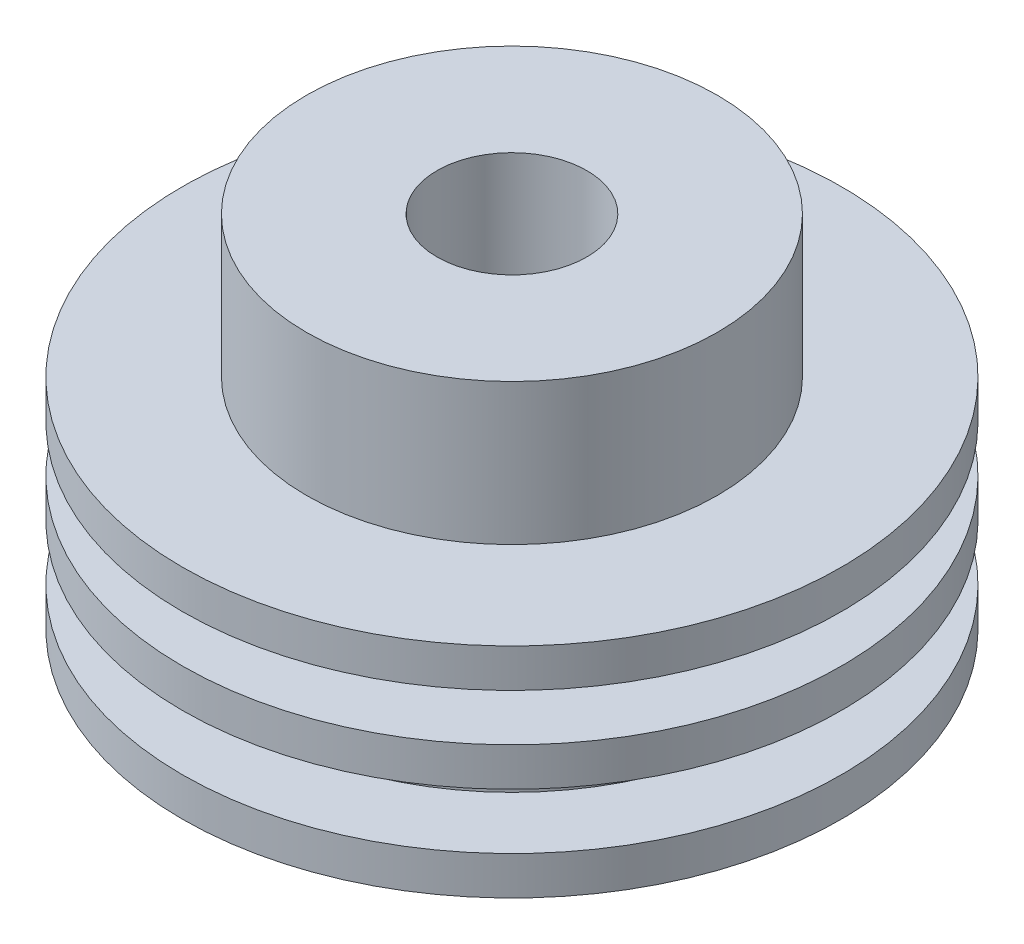
ISO-10303-21;
HEADER;
FILE_DESCRIPTION(('STEP AP214'),'2;1');
FILE_NAME('part.step','',(''),(''),'','','');
FILE_SCHEMA(('AUTOMOTIVE_DESIGN { 1 0 10303 214 1 1 1 1 }'));
ENDSEC;
DATA;
#1=APPLICATION_CONTEXT('core data for automotive mechanical design processes');
#2=APPLICATION_PROTOCOL_DEFINITION('international standard','automotive_design',2000,#1);
#3=PRODUCT_CONTEXT('',#1,'mechanical');
#4=PRODUCT('Part','Part','',(#3));
#5=PRODUCT_RELATED_PRODUCT_CATEGORY('part','',(#4));
#6=PRODUCT_DEFINITION_FORMATION('','',#4);
#7=PRODUCT_DEFINITION_CONTEXT('part definition',#1,'design');
#8=PRODUCT_DEFINITION('design','',#6,#7);
#9=PRODUCT_DEFINITION_SHAPE('','',#8);
#10=(LENGTH_UNIT() NAMED_UNIT(*) SI_UNIT(.MILLI.,.METRE.));
#11=(NAMED_UNIT(*) PLANE_ANGLE_UNIT() SI_UNIT($,.RADIAN.));
#12=(NAMED_UNIT(*) SI_UNIT($,.STERADIAN.) SOLID_ANGLE_UNIT());
#13=UNCERTAINTY_MEASURE_WITH_UNIT(LENGTH_MEASURE(1.E-05),#10,'distance_accuracy_value','');
#14=(GEOMETRIC_REPRESENTATION_CONTEXT(3) GLOBAL_UNCERTAINTY_ASSIGNED_CONTEXT((#13)) GLOBAL_UNIT_ASSIGNED_CONTEXT((#10,
#11,#12)) REPRESENTATION_CONTEXT('',''));
#15=CARTESIAN_POINT('',(0.,0.,0.));
#16=DIRECTION('',(0.,0.,1.));
#17=DIRECTION('',(1.,0.,0.));
#18=AXIS2_PLACEMENT_3D('',#15,#16,#17);
#19=CARTESIAN_POINT('',(0.,82.9719775820657,0.));
#20=DIRECTION('',(0.,1.,0.));
#21=DIRECTION('',(0.,0.,1.));
#22=AXIS2_PLACEMENT_3D('',#19,#20,#21);
#23=CYLINDRICAL_SURFACE('',#22,17.4105133286958);
#24=CARTESIAN_POINT('',(0.,61.7529144627177,0.));
#25=DIRECTION('',(0.,1.,0.));
#26=DIRECTION('',(0.,0.,1.));
#27=AXIS2_PLACEMENT_3D('',#24,#25,#26);
#28=CIRCLE('',#27,17.4105133286958);
#29=CARTESIAN_POINT('',(0.,61.7529144627177,17.4105133286958));
#30=VERTEX_POINT('',#29);
#31=EDGE_CURVE('E10',#30,#30,#28,.T.);
#32=ORIENTED_EDGE('',*,*,#31,.F.);
#33=EDGE_LOOP('',(#32));
#34=FACE_BOUND('',#33,.T.);
#35=CARTESIAN_POINT('',(0.,49.7831865492394,0.));
#36=DIRECTION('',(0.,1.,0.));
#37=DIRECTION('',(0.,0.,1.));
#38=AXIS2_PLACEMENT_3D('',#35,#36,#37);
#39=CIRCLE('',#38,17.4105133286958);
#40=CARTESIAN_POINT('',(0.,49.7831865492394,17.4105133286958));
#41=VERTEX_POINT('',#40);
#42=EDGE_CURVE('E96',#41,#41,#39,.T.);
#43=ORIENTED_EDGE('',*,*,#42,.T.);
#44=EDGE_LOOP('',(#43));
#45=FACE_BOUND('',#44,.T.);
#46=ADVANCED_FACE('F37',(#34,#45),#23,.T.);
#47=CARTESIAN_POINT('',(6.34758298442034,61.7529144627177,0.));
#48=DIRECTION('',(0.,-1.,0.));
#49=DIRECTION('',(0.,0.,-1.));
#50=AXIS2_PLACEMENT_3D('',#47,#48,#49);
#51=PLANE('',#50);
#52=CARTESIAN_POINT('',(0.,61.7529144627177,0.));
#53=DIRECTION('',(0.,1.,0.));
#54=DIRECTION('',(0.,0.,1.));
#55=AXIS2_PLACEMENT_3D('',#52,#53,#54);
#56=CIRCLE('',#55,6.34758298442034);
#57=CARTESIAN_POINT('',(0.,61.7529144627177,6.34758298442034));
#58=VERTEX_POINT('',#57);
#59=EDGE_CURVE('E44',#58,#58,#56,.T.);
#60=ORIENTED_EDGE('',*,*,#59,.F.);
#61=EDGE_LOOP('',(#60));
#62=FACE_BOUND('',#61,.T.);
#63=ORIENTED_EDGE('',*,*,#31,.T.);
#64=EDGE_LOOP('',(#63));
#65=FACE_BOUND('',#64,.T.);
#66=ADVANCED_FACE('F170',(#62,#65),#51,.F.);
#67=CARTESIAN_POINT('',(0.,82.9719775820657,0.));
#68=DIRECTION('',(0.,1.,0.));
#69=DIRECTION('',(0.,0.,1.));
#70=AXIS2_PLACEMENT_3D('',#67,#68,#69);
#71=CYLINDRICAL_SURFACE('',#70,6.34758298442034);
#72=CARTESIAN_POINT('',(0.,31.2845161375002,0.));
#73=DIRECTION('',(0.,1.,0.));
#74=DIRECTION('',(0.,0.,1.));
#75=AXIS2_PLACEMENT_3D('',#72,#73,#74);
#76=CIRCLE('',#75,6.34758298442034);
#77=CARTESIAN_POINT('',(0.,31.2845161375002,6.34758298442034));
#78=VERTEX_POINT('',#77);
#79=EDGE_CURVE('E49',#78,#78,#76,.T.);
#80=ORIENTED_EDGE('',*,*,#79,.F.);
#81=EDGE_LOOP('',(#80));
#82=FACE_BOUND('',#81,.T.);
#83=ORIENTED_EDGE('',*,*,#59,.T.);
#84=EDGE_LOOP('',(#83));
#85=FACE_BOUND('',#84,.T.);
#86=ADVANCED_FACE('F165',(#82,#85),#71,.F.);
#87=CARTESIAN_POINT('',(27.9293651314494,31.2845161375002,0.));
#88=DIRECTION('',(0.,1.,0.));
#89=DIRECTION('',(0.,0.,1.));
#90=AXIS2_PLACEMENT_3D('',#87,#88,#89);
#91=PLANE('',#90);
#92=CARTESIAN_POINT('',(0.,31.2845161375002,0.));
#93=DIRECTION('',(0.,1.,0.));
#94=DIRECTION('',(0.,0.,1.));
#95=AXIS2_PLACEMENT_3D('',#92,#93,#94);
#96=CIRCLE('',#95,27.9293651314494);
#97=CARTESIAN_POINT('',(0.,31.2845161375002,27.9293651314494));
#98=VERTEX_POINT('',#97);
#99=EDGE_CURVE('E54',#98,#98,#96,.T.);
#100=ORIENTED_EDGE('',*,*,#99,.F.);
#101=EDGE_LOOP('',(#100));
#102=FACE_BOUND('',#101,.T.);
#103=ORIENTED_EDGE('',*,*,#79,.T.);
#104=EDGE_LOOP('',(#103));
#105=FACE_BOUND('',#104,.T.);
#106=ADVANCED_FACE('F159',(#102,#105),#91,.F.);
#107=CARTESIAN_POINT('',(0.,82.9719775820657,0.));
#108=DIRECTION('',(0.,1.,0.));
#109=DIRECTION('',(0.,0.,1.));
#110=AXIS2_PLACEMENT_3D('',#107,#108,#109);
#111=CYLINDRICAL_SURFACE('',#110,27.9293651314494);
#112=CARTESIAN_POINT('',(0.,34.5489873866306,0.));
#113=DIRECTION('',(0.,1.,0.));
#114=DIRECTION('',(0.,0.,1.));
#115=AXIS2_PLACEMENT_3D('',#112,#113,#114);
#116=CIRCLE('',#115,27.9293651314494);
#117=CARTESIAN_POINT('',(0.,34.5489873866306,27.9293651314494));
#118=VERTEX_POINT('',#117);
#119=EDGE_CURVE('E60',#118,#118,#116,.T.);
#120=ORIENTED_EDGE('',*,*,#119,.F.);
#121=EDGE_LOOP('',(#120));
#122=FACE_BOUND('',#121,.T.);
#123=ORIENTED_EDGE('',*,*,#99,.T.);
#124=EDGE_LOOP('',(#123));
#125=FACE_BOUND('',#124,.T.);
#126=ADVANCED_FACE('F153',(#122,#125),#111,.T.);
#127=CARTESIAN_POINT('',(21.5817821470291,34.5489873866306,0.));
#128=DIRECTION('',(0.,-1.,0.));
#129=DIRECTION('',(0.,0.,-1.));
#130=AXIS2_PLACEMENT_3D('',#127,#128,#129);
#131=PLANE('',#130);
#132=CARTESIAN_POINT('',(0.,34.5489873866306,0.));
#133=DIRECTION('',(0.,1.,0.));
#134=DIRECTION('',(0.,0.,1.));
#135=AXIS2_PLACEMENT_3D('',#132,#133,#134);
#136=CIRCLE('',#135,21.5817821470291);
#137=CARTESIAN_POINT('',(0.,34.5489873866306,21.5817821470291));
#138=VERTEX_POINT('',#137);
#139=EDGE_CURVE('E64',#138,#138,#136,.T.);
#140=ORIENTED_EDGE('',*,*,#139,.F.);
#141=EDGE_LOOP('',(#140));
#142=FACE_BOUND('',#141,.T.);
#143=ORIENTED_EDGE('',*,*,#119,.T.);
#144=EDGE_LOOP('',(#143));
#145=FACE_BOUND('',#144,.T.);
#146=ADVANCED_FACE('F147',(#142,#145),#131,.F.);
#147=CARTESIAN_POINT('',(0.,82.9719775820657,0.));
#148=DIRECTION('',(0.,1.,0.));
#149=DIRECTION('',(0.,0.,1.));
#150=AXIS2_PLACEMENT_3D('',#147,#148,#149);
#151=CYLINDRICAL_SURFACE('',#150,21.5817821470291);
#152=CARTESIAN_POINT('',(0.,39.2643347464857,0.));
#153=DIRECTION('',(0.,1.,0.));
#154=DIRECTION('',(0.,0.,1.));
#155=AXIS2_PLACEMENT_3D('',#152,#153,#154);
#156=CIRCLE('',#155,21.5817821470291);
#157=CARTESIAN_POINT('',(0.,39.2643347464857,21.5817821470291));
#158=VERTEX_POINT('',#157);
#159=EDGE_CURVE('E68',#158,#158,#156,.T.);
#160=ORIENTED_EDGE('',*,*,#159,.F.);
#161=EDGE_LOOP('',(#160));
#162=FACE_BOUND('',#161,.T.);
#163=ORIENTED_EDGE('',*,*,#139,.T.);
#164=EDGE_LOOP('',(#163));
#165=FACE_BOUND('',#164,.T.);
#166=ADVANCED_FACE('F141',(#162,#165),#151,.T.);
#167=CARTESIAN_POINT('',(27.9293651314494,39.2643347464857,0.));
#168=DIRECTION('',(0.,1.,0.));
#169=DIRECTION('',(0.,0.,1.));
#170=AXIS2_PLACEMENT_3D('',#167,#168,#169);
#171=PLANE('',#170);
#172=CARTESIAN_POINT('',(0.,39.2643347464857,0.));
#173=DIRECTION('',(0.,1.,0.));
#174=DIRECTION('',(0.,0.,1.));
#175=AXIS2_PLACEMENT_3D('',#172,#173,#174);
#176=CIRCLE('',#175,27.9293651314494);
#177=CARTESIAN_POINT('',(0.,39.2643347464857,27.9293651314494));
#178=VERTEX_POINT('',#177);
#179=EDGE_CURVE('E72',#178,#178,#176,.T.);
#180=ORIENTED_EDGE('',*,*,#179,.F.);
#181=EDGE_LOOP('',(#180));
#182=FACE_BOUND('',#181,.T.);
#183=ORIENTED_EDGE('',*,*,#159,.T.);
#184=EDGE_LOOP('',(#183));
#185=FACE_BOUND('',#184,.T.);
#186=ADVANCED_FACE('F135',(#182,#185),#171,.F.);
#187=CARTESIAN_POINT('',(0.,82.9719775820657,0.));
#188=DIRECTION('',(0.,1.,0.));
#189=DIRECTION('',(0.,0.,1.));
#190=AXIS2_PLACEMENT_3D('',#187,#188,#189);
#191=CYLINDRICAL_SURFACE('',#190,27.9293651314494);
#192=CARTESIAN_POINT('',(0.,42.5288059956162,0.));
#193=DIRECTION('',(0.,1.,0.));
#194=DIRECTION('',(0.,0.,1.));
#195=AXIS2_PLACEMENT_3D('',#192,#193,#194);
#196=CIRCLE('',#195,27.9293651314494);
#197=CARTESIAN_POINT('',(0.,42.5288059956162,27.9293651314494));
#198=VERTEX_POINT('',#197);
#199=EDGE_CURVE('E76',#198,#198,#196,.T.);
#200=ORIENTED_EDGE('',*,*,#199,.F.);
#201=EDGE_LOOP('',(#200));
#202=FACE_BOUND('',#201,.T.);
#203=ORIENTED_EDGE('',*,*,#179,.T.);
#204=EDGE_LOOP('',(#203));
#205=FACE_BOUND('',#204,.T.);
#206=ADVANCED_FACE('F129',(#202,#205),#191,.T.);
#207=CARTESIAN_POINT('',(21.5817821470291,42.5288059956162,0.));
#208=DIRECTION('',(0.,-1.,0.));
#209=DIRECTION('',(0.,0.,-1.));
#210=AXIS2_PLACEMENT_3D('',#207,#208,#209);
#211=PLANE('',#210);
#212=CARTESIAN_POINT('',(0.,42.5288059956162,0.));
#213=DIRECTION('',(0.,1.,0.));
#214=DIRECTION('',(0.,0.,1.));
#215=AXIS2_PLACEMENT_3D('',#212,#213,#214);
#216=CIRCLE('',#215,21.5817821470291);
#217=CARTESIAN_POINT('',(0.,42.5288059956162,21.5817821470291));
#218=VERTEX_POINT('',#217);
#219=EDGE_CURVE('E80',#218,#218,#216,.T.);
#220=ORIENTED_EDGE('',*,*,#219,.F.);
#221=EDGE_LOOP('',(#220));
#222=FACE_BOUND('',#221,.T.);
#223=ORIENTED_EDGE('',*,*,#199,.T.);
#224=EDGE_LOOP('',(#223));
#225=FACE_BOUND('',#224,.T.);
#226=ADVANCED_FACE('F123',(#222,#225),#211,.F.);
#227=CARTESIAN_POINT('',(0.,82.9719775820657,0.));
#228=DIRECTION('',(0.,1.,0.));
#229=DIRECTION('',(0.,0.,1.));
#230=AXIS2_PLACEMENT_3D('',#227,#228,#229);
#231=CYLINDRICAL_SURFACE('',#230,21.5817821470291);
#232=CARTESIAN_POINT('',(0.,46.5187153001089,0.));
#233=DIRECTION('',(0.,1.,0.));
#234=DIRECTION('',(0.,0.,1.));
#235=AXIS2_PLACEMENT_3D('',#232,#233,#234);
#236=CIRCLE('',#235,21.5817821470291);
#237=CARTESIAN_POINT('',(0.,46.5187153001089,21.5817821470291));
#238=VERTEX_POINT('',#237);
#239=EDGE_CURVE('E84',#238,#238,#236,.T.);
#240=ORIENTED_EDGE('',*,*,#239,.F.);
#241=EDGE_LOOP('',(#240));
#242=FACE_BOUND('',#241,.T.);
#243=ORIENTED_EDGE('',*,*,#219,.T.);
#244=EDGE_LOOP('',(#243));
#245=FACE_BOUND('',#244,.T.);
#246=ADVANCED_FACE('F117',(#242,#245),#231,.T.);
#247=CARTESIAN_POINT('',(27.9293651314494,46.5187153001089,0.));
#248=DIRECTION('',(0.,1.,0.));
#249=DIRECTION('',(0.,0.,1.));
#250=AXIS2_PLACEMENT_3D('',#247,#248,#249);
#251=PLANE('',#250);
#252=CARTESIAN_POINT('',(0.,46.5187153001089,0.));
#253=DIRECTION('',(0.,1.,0.));
#254=DIRECTION('',(0.,0.,1.));
#255=AXIS2_PLACEMENT_3D('',#252,#253,#254);
#256=CIRCLE('',#255,27.9293651314494);
#257=CARTESIAN_POINT('',(0.,46.5187153001089,27.9293651314494));
#258=VERTEX_POINT('',#257);
#259=EDGE_CURVE('E88',#258,#258,#256,.T.);
#260=ORIENTED_EDGE('',*,*,#259,.F.);
#261=EDGE_LOOP('',(#260));
#262=FACE_BOUND('',#261,.T.);
#263=ORIENTED_EDGE('',*,*,#239,.T.);
#264=EDGE_LOOP('',(#263));
#265=FACE_BOUND('',#264,.T.);
#266=ADVANCED_FACE('F111',(#262,#265),#251,.F.);
#267=CARTESIAN_POINT('',(0.,82.9719775820657,0.));
#268=DIRECTION('',(0.,1.,0.));
#269=DIRECTION('',(0.,0.,1.));
#270=AXIS2_PLACEMENT_3D('',#267,#268,#269);
#271=CYLINDRICAL_SURFACE('',#270,27.9293651314494);
#272=CARTESIAN_POINT('',(0.,49.7831865492394,0.));
#273=DIRECTION('',(0.,1.,0.));
#274=DIRECTION('',(0.,0.,1.));
#275=AXIS2_PLACEMENT_3D('',#272,#273,#274);
#276=CIRCLE('',#275,27.9293651314494);
#277=CARTESIAN_POINT('',(0.,49.7831865492394,27.9293651314494));
#278=VERTEX_POINT('',#277);
#279=EDGE_CURVE('E92',#278,#278,#276,.T.);
#280=ORIENTED_EDGE('',*,*,#279,.F.);
#281=EDGE_LOOP('',(#280));
#282=FACE_BOUND('',#281,.T.);
#283=ORIENTED_EDGE('',*,*,#259,.T.);
#284=EDGE_LOOP('',(#283));
#285=FACE_BOUND('',#284,.T.);
#286=ADVANCED_FACE('F105',(#282,#285),#271,.T.);
#287=CARTESIAN_POINT('',(17.4105133286958,49.7831865492394,0.));
#288=DIRECTION('',(0.,-1.,0.));
#289=DIRECTION('',(0.,0.,-1.));
#290=AXIS2_PLACEMENT_3D('',#287,#288,#289);
#291=PLANE('',#290);
#292=ORIENTED_EDGE('',*,*,#42,.F.);
#293=EDGE_LOOP('',(#292));
#294=FACE_BOUND('',#293,.T.);
#295=ORIENTED_EDGE('',*,*,#279,.T.);
#296=EDGE_LOOP('',(#295));
#297=FACE_BOUND('',#296,.T.);
#298=ADVANCED_FACE('F102',(#294,#297),#291,.F.);
#299=CLOSED_SHELL('',(#46,#66,#86,#106,#126,#146,#166,#186,#206,#226,#246,#266,#286,#298));
#300=MANIFOLD_SOLID_BREP('B2',#299);
#301=ADVANCED_BREP_SHAPE_REPRESENTATION('',(#18,#300),#14);
#302=SHAPE_DEFINITION_REPRESENTATION(#9,#301);
ENDSEC;
END-ISO-10303-21;
